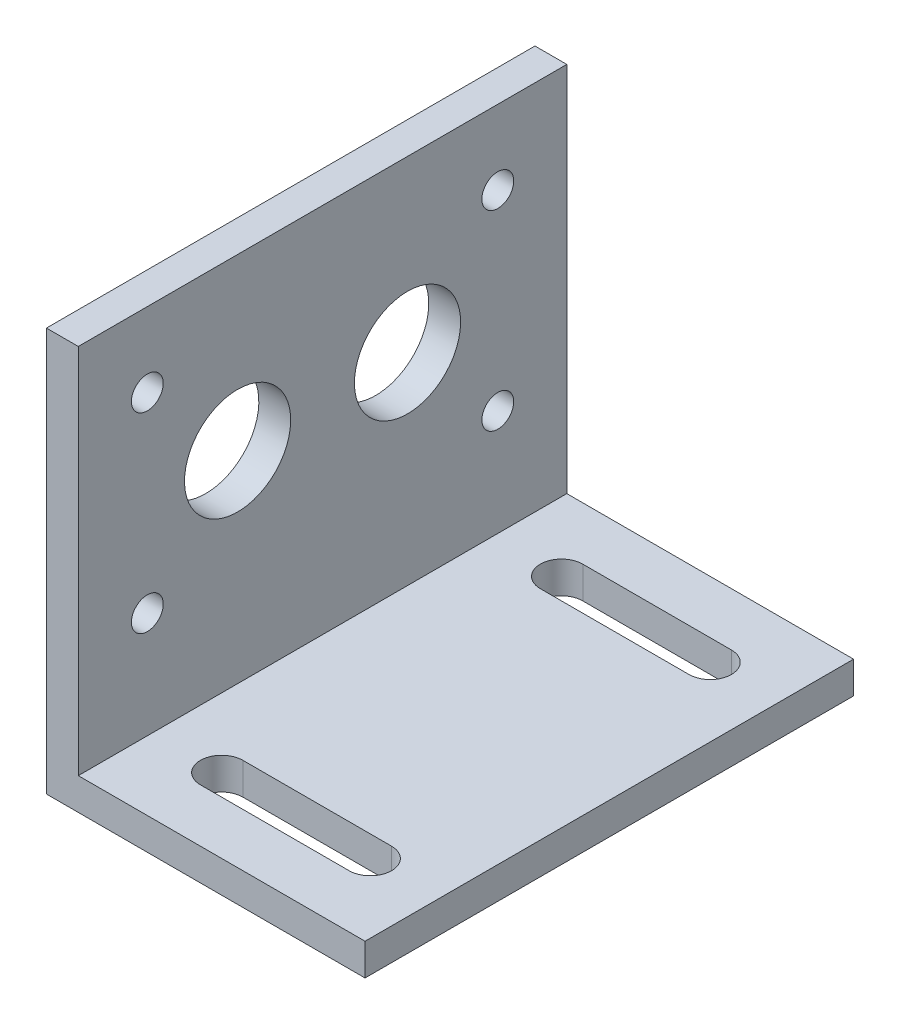
ISO-10303-21;
HEADER;
FILE_DESCRIPTION(('STEP AP214'),'2;1');
FILE_NAME('part.step','',(''),(''),'','','');
FILE_SCHEMA(('AUTOMOTIVE_DESIGN { 1 0 10303 214 1 1 1 1 }'));
ENDSEC;
DATA;
#1=APPLICATION_CONTEXT('core data for automotive mechanical design processes');
#2=APPLICATION_PROTOCOL_DEFINITION('international standard','automotive_design',2000,#1);
#3=PRODUCT_CONTEXT('',#1,'mechanical');
#4=PRODUCT('Part','Part','',(#3));
#5=PRODUCT_RELATED_PRODUCT_CATEGORY('part','',(#4));
#6=PRODUCT_DEFINITION_FORMATION('','',#4);
#7=PRODUCT_DEFINITION_CONTEXT('part definition',#1,'design');
#8=PRODUCT_DEFINITION('design','',#6,#7);
#9=PRODUCT_DEFINITION_SHAPE('','',#8);
#10=(LENGTH_UNIT() NAMED_UNIT(*) SI_UNIT(.MILLI.,.METRE.));
#11=(NAMED_UNIT(*) PLANE_ANGLE_UNIT() SI_UNIT($,.RADIAN.));
#12=(NAMED_UNIT(*) SI_UNIT($,.STERADIAN.) SOLID_ANGLE_UNIT());
#13=UNCERTAINTY_MEASURE_WITH_UNIT(LENGTH_MEASURE(1.E-05),#10,'distance_accuracy_value','');
#14=(GEOMETRIC_REPRESENTATION_CONTEXT(3) GLOBAL_UNCERTAINTY_ASSIGNED_CONTEXT((#13)) GLOBAL_UNIT_ASSIGNED_CONTEXT((#10,
#11,#12)) REPRESENTATION_CONTEXT('',''));
#15=CARTESIAN_POINT('',(0.,0.,0.));
#16=DIRECTION('',(0.,0.,1.));
#17=DIRECTION('',(1.,0.,0.));
#18=AXIS2_PLACEMENT_3D('',#15,#16,#17);
#19=CARTESIAN_POINT('',(0.,38.,46.));
#20=DIRECTION('',(1.,0.,0.));
#21=DIRECTION('',(0.,1.,0.));
#22=AXIS2_PLACEMENT_3D('',#19,#20,#21);
#23=PLANE('',#22);
#24=CARTESIAN_POINT('',(0.,22.,31.));
#25=DIRECTION('',(1.,0.,0.));
#26=DIRECTION('',(0.,1.,0.));
#27=AXIS2_PLACEMENT_3D('',#24,#25,#26);
#28=CIRCLE('',#27,5.);
#29=CARTESIAN_POINT('',(0.,27.,31.));
#30=VERTEX_POINT('',#29);
#31=EDGE_CURVE('E238',#30,#30,#28,.T.);
#32=ORIENTED_EDGE('',*,*,#31,.T.);
#33=EDGE_LOOP('',(#32));
#34=FACE_BOUND('',#33,.T.);
#35=CARTESIAN_POINT('',(0.,13.,6.5));
#36=DIRECTION('',(1.,0.,0.));
#37=DIRECTION('',(0.,1.,0.));
#38=AXIS2_PLACEMENT_3D('',#35,#36,#37);
#39=CIRCLE('',#38,1.5);
#40=CARTESIAN_POINT('',(0.,14.5,6.5));
#41=VERTEX_POINT('',#40);
#42=EDGE_CURVE('E235',#41,#41,#39,.T.);
#43=ORIENTED_EDGE('',*,*,#42,.T.);
#44=EDGE_LOOP('',(#43));
#45=FACE_BOUND('',#44,.T.);
#46=CARTESIAN_POINT('',(0.,31.,6.5));
#47=DIRECTION('',(1.,0.,0.));
#48=DIRECTION('',(0.,1.,0.));
#49=AXIS2_PLACEMENT_3D('',#46,#47,#48);
#50=CIRCLE('',#49,1.5);
#51=CARTESIAN_POINT('',(0.,32.5,6.5));
#52=VERTEX_POINT('',#51);
#53=EDGE_CURVE('E232',#52,#52,#50,.T.);
#54=ORIENTED_EDGE('',*,*,#53,.T.);
#55=EDGE_LOOP('',(#54));
#56=FACE_BOUND('',#55,.T.);
#57=CARTESIAN_POINT('',(0.,13.,39.5));
#58=DIRECTION('',(1.,0.,0.));
#59=DIRECTION('',(0.,1.,0.));
#60=AXIS2_PLACEMENT_3D('',#57,#58,#59);
#61=CIRCLE('',#60,1.5);
#62=CARTESIAN_POINT('',(0.,14.5,39.5));
#63=VERTEX_POINT('',#62);
#64=EDGE_CURVE('E229',#63,#63,#61,.T.);
#65=ORIENTED_EDGE('',*,*,#64,.T.);
#66=EDGE_LOOP('',(#65));
#67=FACE_BOUND('',#66,.T.);
#68=CARTESIAN_POINT('',(0.,22.,15.));
#69=DIRECTION('',(1.,0.,0.));
#70=DIRECTION('',(0.,1.,0.));
#71=AXIS2_PLACEMENT_3D('',#68,#69,#70);
#72=CIRCLE('',#71,5.);
#73=CARTESIAN_POINT('',(0.,27.,15.));
#74=VERTEX_POINT('',#73);
#75=EDGE_CURVE('E226',#74,#74,#72,.T.);
#76=ORIENTED_EDGE('',*,*,#75,.T.);
#77=EDGE_LOOP('',(#76));
#78=FACE_BOUND('',#77,.T.);
#79=CARTESIAN_POINT('',(0.,31.,39.5));
#80=DIRECTION('',(1.,0.,0.));
#81=DIRECTION('',(0.,1.,0.));
#82=AXIS2_PLACEMENT_3D('',#79,#80,#81);
#83=CIRCLE('',#82,1.5);
#84=CARTESIAN_POINT('',(0.,32.5,39.5));
#85=VERTEX_POINT('',#84);
#86=EDGE_CURVE('E223',#85,#85,#83,.T.);
#87=ORIENTED_EDGE('',*,*,#86,.T.);
#88=EDGE_LOOP('',(#87));
#89=FACE_BOUND('',#88,.T.);
#90=DIRECTION('',(0.,-1.,0.));
#91=VECTOR('',#90,1.);
#92=CARTESIAN_POINT('',(0.,38.,0.));
#93=LINE('',#92,#91);
#94=CARTESIAN_POINT('',(0.,38.,0.));
#95=VERTEX_POINT('',#94);
#96=CARTESIAN_POINT('',(0.,0.,0.));
#97=VERTEX_POINT('',#96);
#98=EDGE_CURVE('E241',#95,#97,#93,.T.);
#99=ORIENTED_EDGE('',*,*,#98,.T.);
#100=DIRECTION('',(0.,0.,-1.));
#101=VECTOR('',#100,1.);
#102=CARTESIAN_POINT('',(0.,0.,46.));
#103=LINE('',#102,#101);
#104=CARTESIAN_POINT('',(0.,0.,46.));
#105=VERTEX_POINT('',#104);
#106=EDGE_CURVE('E11',#105,#97,#103,.T.);
#107=ORIENTED_EDGE('',*,*,#106,.F.);
#108=DIRECTION('',(0.,-1.,0.));
#109=VECTOR('',#108,1.);
#110=CARTESIAN_POINT('',(0.,38.,46.));
#111=LINE('',#110,#109);
#112=CARTESIAN_POINT('',(0.,38.,46.));
#113=VERTEX_POINT('',#112);
#114=EDGE_CURVE('E242',#113,#105,#111,.T.);
#115=ORIENTED_EDGE('',*,*,#114,.F.);
#116=DIRECTION('',(0.,0.,-1.));
#117=VECTOR('',#116,1.);
#118=CARTESIAN_POINT('',(0.,38.,46.));
#119=LINE('',#118,#117);
#120=EDGE_CURVE('E256',#113,#95,#119,.T.);
#121=ORIENTED_EDGE('',*,*,#120,.T.);
#122=EDGE_LOOP('',(#99,#107,#115,#121));
#123=FACE_BOUND('',#122,.T.);
#124=ADVANCED_FACE('F35',(#34,#45,#56,#67,#78,#89,#123),#23,.F.);
#125=CARTESIAN_POINT('',(0.,0.,46.));
#126=DIRECTION('',(0.,1.,0.));
#127=DIRECTION('',(0.,0.,1.));
#128=AXIS2_PLACEMENT_3D('',#125,#126,#127);
#129=PLANE('',#128);
#130=DIRECTION('',(-1.,0.,0.));
#131=VECTOR('',#130,1.);
#132=CARTESIAN_POINT('',(0.,0.,5.));
#133=LINE('',#132,#131);
#134=CARTESIAN_POINT('',(23.5,0.,5.));
#135=VERTEX_POINT('',#134);
#136=CARTESIAN_POINT('',(9.5,0.,5.));
#137=VERTEX_POINT('',#136);
#138=EDGE_CURVE('E199',#135,#137,#133,.T.);
#139=ORIENTED_EDGE('',*,*,#138,.T.);
#140=CARTESIAN_POINT('',(9.5,0.,7.));
#141=DIRECTION('',(0.,1.,0.));
#142=DIRECTION('',(0.,0.,1.));
#143=AXIS2_PLACEMENT_3D('',#140,#141,#142);
#144=CIRCLE('',#143,2.);
#145=CARTESIAN_POINT('',(9.5,0.,9.));
#146=VERTEX_POINT('',#145);
#147=EDGE_CURVE('E202',#137,#146,#144,.T.);
#148=ORIENTED_EDGE('',*,*,#147,.T.);
#149=DIRECTION('',(1.,0.,0.));
#150=VECTOR('',#149,1.);
#151=CARTESIAN_POINT('',(0.,0.,8.99999999999999));
#152=LINE('',#151,#150);
#153=CARTESIAN_POINT('',(23.5,0.,8.99999999999999));
#154=VERTEX_POINT('',#153);
#155=EDGE_CURVE('E196',#146,#154,#152,.T.);
#156=ORIENTED_EDGE('',*,*,#155,.T.);
#157=CARTESIAN_POINT('',(23.5,0.,7.));
#158=DIRECTION('',(0.,1.,0.));
#159=DIRECTION('',(0.,0.,1.));
#160=AXIS2_PLACEMENT_3D('',#157,#158,#159);
#161=CIRCLE('',#160,2.);
#162=EDGE_CURVE('E140',#154,#135,#161,.T.);
#163=ORIENTED_EDGE('',*,*,#162,.T.);
#164=EDGE_LOOP('',(#139,#148,#156,#163));
#165=FACE_BOUND('',#164,.T.);
#166=DIRECTION('',(-1.,0.,0.));
#167=VECTOR('',#166,1.);
#168=CARTESIAN_POINT('',(0.,0.,37.));
#169=LINE('',#168,#167);
#170=CARTESIAN_POINT('',(23.5,0.,37.));
#171=VERTEX_POINT('',#170);
#172=CARTESIAN_POINT('',(9.5,0.,37.));
#173=VERTEX_POINT('',#172);
#174=EDGE_CURVE('E190',#171,#173,#169,.T.);
#175=ORIENTED_EDGE('',*,*,#174,.T.);
#176=CARTESIAN_POINT('',(9.5,0.,39.));
#177=DIRECTION('',(0.,1.,0.));
#178=DIRECTION('',(0.,0.,1.));
#179=AXIS2_PLACEMENT_3D('',#176,#177,#178);
#180=CIRCLE('',#179,2.);
#181=CARTESIAN_POINT('',(9.5,0.,41.));
#182=VERTEX_POINT('',#181);
#183=EDGE_CURVE('E193',#173,#182,#180,.T.);
#184=ORIENTED_EDGE('',*,*,#183,.T.);
#185=DIRECTION('',(1.,0.,0.));
#186=VECTOR('',#185,1.);
#187=CARTESIAN_POINT('',(0.,0.,41.));
#188=LINE('',#187,#186);
#189=CARTESIAN_POINT('',(23.5,0.,41.));
#190=VERTEX_POINT('',#189);
#191=EDGE_CURVE('E164',#182,#190,#188,.T.);
#192=ORIENTED_EDGE('',*,*,#191,.T.);
#193=CARTESIAN_POINT('',(23.5,0.,39.));
#194=DIRECTION('',(0.,1.,0.));
#195=DIRECTION('',(0.,0.,1.));
#196=AXIS2_PLACEMENT_3D('',#193,#194,#195);
#197=CIRCLE('',#196,2.);
#198=EDGE_CURVE('E187',#190,#171,#197,.T.);
#199=ORIENTED_EDGE('',*,*,#198,.T.);
#200=EDGE_LOOP('',(#175,#184,#192,#199));
#201=FACE_BOUND('',#200,.T.);
#202=DIRECTION('',(1.,0.,0.));
#203=VECTOR('',#202,1.);
#204=CARTESIAN_POINT('',(0.,0.,0.));
#205=LINE('',#204,#203);
#206=CARTESIAN_POINT('',(30.,0.,0.));
#207=VERTEX_POINT('',#206);
#208=EDGE_CURVE('E259',#97,#207,#205,.T.);
#209=ORIENTED_EDGE('',*,*,#208,.T.);
#210=DIRECTION('',(0.,0.,-1.));
#211=VECTOR('',#210,1.);
#212=CARTESIAN_POINT('',(30.,0.,46.));
#213=LINE('',#212,#211);
#214=CARTESIAN_POINT('',(30.,0.,46.));
#215=VERTEX_POINT('',#214);
#216=EDGE_CURVE('E42',#215,#207,#213,.T.);
#217=ORIENTED_EDGE('',*,*,#216,.F.);
#218=DIRECTION('',(1.,0.,0.));
#219=VECTOR('',#218,1.);
#220=CARTESIAN_POINT('',(0.,0.,46.));
#221=LINE('',#220,#219);
#222=EDGE_CURVE('E245',#105,#215,#221,.T.);
#223=ORIENTED_EDGE('',*,*,#222,.F.);
#224=ORIENTED_EDGE('',*,*,#106,.T.);
#225=EDGE_LOOP('',(#209,#217,#223,#224));
#226=FACE_BOUND('',#225,.T.);
#227=ADVANCED_FACE('F305',(#165,#201,#226),#129,.F.);
#228=CARTESIAN_POINT('',(30.,0.,46.));
#229=DIRECTION('',(-1.,0.,0.));
#230=DIRECTION('',(0.,0.,1.));
#231=AXIS2_PLACEMENT_3D('',#228,#229,#230);
#232=PLANE('',#231);
#233=DIRECTION('',(0.,1.,0.));
#234=VECTOR('',#233,1.);
#235=CARTESIAN_POINT('',(30.,0.,0.));
#236=LINE('',#235,#234);
#237=CARTESIAN_POINT('',(30.,3.,0.));
#238=VERTEX_POINT('',#237);
#239=EDGE_CURVE('E261',#207,#238,#236,.T.);
#240=ORIENTED_EDGE('',*,*,#239,.T.);
#241=DIRECTION('',(0.,0.,-1.));
#242=VECTOR('',#241,1.);
#243=CARTESIAN_POINT('',(30.,3.,46.));
#244=LINE('',#243,#242);
#245=CARTESIAN_POINT('',(30.,3.,46.));
#246=VERTEX_POINT('',#245);
#247=EDGE_CURVE('E276',#246,#238,#244,.T.);
#248=ORIENTED_EDGE('',*,*,#247,.F.);
#249=DIRECTION('',(0.,1.,0.));
#250=VECTOR('',#249,1.);
#251=CARTESIAN_POINT('',(30.,0.,46.));
#252=LINE('',#251,#250);
#253=EDGE_CURVE('E248',#215,#246,#252,.T.);
#254=ORIENTED_EDGE('',*,*,#253,.F.);
#255=ORIENTED_EDGE('',*,*,#216,.T.);
#256=EDGE_LOOP('',(#240,#248,#254,#255));
#257=FACE_BOUND('',#256,.T.);
#258=ADVANCED_FACE('F283',(#257),#232,.F.);
#259=CARTESIAN_POINT('',(30.,3.,46.));
#260=DIRECTION('',(0.,-1.,0.));
#261=DIRECTION('',(1.,0.,0.));
#262=AXIS2_PLACEMENT_3D('',#259,#260,#261);
#263=PLANE('',#262);
#264=DIRECTION('',(1.,0.,0.));
#265=VECTOR('',#264,1.);
#266=CARTESIAN_POINT('',(9.5,3.,9.));
#267=LINE('',#266,#265);
#268=CARTESIAN_POINT('',(9.5,3.,8.99999999999999));
#269=VERTEX_POINT('',#268);
#270=CARTESIAN_POINT('',(23.5,3.,9.));
#271=VERTEX_POINT('',#270);
#272=EDGE_CURVE('E147',#269,#271,#267,.T.);
#273=ORIENTED_EDGE('',*,*,#272,.F.);
#274=CARTESIAN_POINT('',(9.5,3.,7.));
#275=DIRECTION('',(0.,1.,0.));
#276=DIRECTION('',(-1.,0.,0.));
#277=AXIS2_PLACEMENT_3D('',#274,#275,#276);
#278=CIRCLE('',#277,2.);
#279=CARTESIAN_POINT('',(9.5,3.,5.));
#280=VERTEX_POINT('',#279);
#281=EDGE_CURVE('E152',#280,#269,#278,.T.);
#282=ORIENTED_EDGE('',*,*,#281,.F.);
#283=DIRECTION('',(-1.,0.,0.));
#284=VECTOR('',#283,1.);
#285=CARTESIAN_POINT('',(9.5,3.,5.));
#286=LINE('',#285,#284);
#287=CARTESIAN_POINT('',(23.5,3.,5.));
#288=VERTEX_POINT('',#287);
#289=EDGE_CURVE('E157',#288,#280,#286,.T.);
#290=ORIENTED_EDGE('',*,*,#289,.F.);
#291=CARTESIAN_POINT('',(23.5,3.,7.));
#292=DIRECTION('',(0.,1.,0.));
#293=DIRECTION('',(-1.,0.,0.));
#294=AXIS2_PLACEMENT_3D('',#291,#292,#293);
#295=CIRCLE('',#294,2.);
#296=EDGE_CURVE('E137',#271,#288,#295,.T.);
#297=ORIENTED_EDGE('',*,*,#296,.F.);
#298=EDGE_LOOP('',(#273,#282,#290,#297));
#299=FACE_BOUND('',#298,.T.);
#300=DIRECTION('',(1.,0.,0.));
#301=VECTOR('',#300,1.);
#302=CARTESIAN_POINT('',(9.5,3.,41.));
#303=LINE('',#302,#301);
#304=CARTESIAN_POINT('',(9.5,3.,41.));
#305=VERTEX_POINT('',#304);
#306=CARTESIAN_POINT('',(23.5,3.,41.));
#307=VERTEX_POINT('',#306);
#308=EDGE_CURVE('E169',#305,#307,#303,.T.);
#309=ORIENTED_EDGE('',*,*,#308,.F.);
#310=CARTESIAN_POINT('',(9.5,3.,39.));
#311=DIRECTION('',(0.,1.,0.));
#312=DIRECTION('',(-1.,0.,0.));
#313=AXIS2_PLACEMENT_3D('',#310,#311,#312);
#314=CIRCLE('',#313,2.);
#315=CARTESIAN_POINT('',(9.5,3.,37.));
#316=VERTEX_POINT('',#315);
#317=EDGE_CURVE('E167',#316,#305,#314,.T.);
#318=ORIENTED_EDGE('',*,*,#317,.F.);
#319=DIRECTION('',(-1.,0.,0.));
#320=VECTOR('',#319,1.);
#321=CARTESIAN_POINT('',(9.5,3.,37.));
#322=LINE('',#321,#320);
#323=CARTESIAN_POINT('',(23.5,3.,37.));
#324=VERTEX_POINT('',#323);
#325=EDGE_CURVE('E174',#324,#316,#322,.T.);
#326=ORIENTED_EDGE('',*,*,#325,.F.);
#327=CARTESIAN_POINT('',(23.5,3.,39.));
#328=DIRECTION('',(0.,1.,0.));
#329=DIRECTION('',(-1.,0.,0.));
#330=AXIS2_PLACEMENT_3D('',#327,#328,#329);
#331=CIRCLE('',#330,2.);
#332=EDGE_CURVE('E171',#307,#324,#331,.T.);
#333=ORIENTED_EDGE('',*,*,#332,.F.);
#334=EDGE_LOOP('',(#309,#318,#326,#333));
#335=FACE_BOUND('',#334,.T.);
#336=DIRECTION('',(-1.,0.,0.));
#337=VECTOR('',#336,1.);
#338=CARTESIAN_POINT('',(30.,3.,0.));
#339=LINE('',#338,#337);
#340=CARTESIAN_POINT('',(3.,3.,0.));
#341=VERTEX_POINT('',#340);
#342=EDGE_CURVE('E263',#238,#341,#339,.T.);
#343=ORIENTED_EDGE('',*,*,#342,.T.);
#344=DIRECTION('',(0.,0.,-1.));
#345=VECTOR('',#344,1.);
#346=CARTESIAN_POINT('',(3.,3.,46.));
#347=LINE('',#346,#345);
#348=CARTESIAN_POINT('',(3.,3.,46.));
#349=VERTEX_POINT('',#348);
#350=EDGE_CURVE('E273',#349,#341,#347,.T.);
#351=ORIENTED_EDGE('',*,*,#350,.F.);
#352=DIRECTION('',(-1.,0.,0.));
#353=VECTOR('',#352,1.);
#354=CARTESIAN_POINT('',(30.,3.,46.));
#355=LINE('',#354,#353);
#356=EDGE_CURVE('E250',#246,#349,#355,.T.);
#357=ORIENTED_EDGE('',*,*,#356,.F.);
#358=ORIENTED_EDGE('',*,*,#247,.T.);
#359=EDGE_LOOP('',(#343,#351,#357,#358));
#360=FACE_BOUND('',#359,.T.);
#361=ADVANCED_FACE('F154',(#299,#335,#360),#263,.F.);
#362=CARTESIAN_POINT('',(3.,3.,46.));
#363=DIRECTION('',(-1.,0.,0.));
#364=DIRECTION('',(0.,-1.,0.));
#365=AXIS2_PLACEMENT_3D('',#362,#363,#364);
#366=PLANE('',#365);
#367=CARTESIAN_POINT('',(3.,22.,31.));
#368=DIRECTION('',(1.,0.,0.));
#369=DIRECTION('',(0.,1.,0.));
#370=AXIS2_PLACEMENT_3D('',#367,#368,#369);
#371=CIRCLE('',#370,5.);
#372=CARTESIAN_POINT('',(3.,27.,31.));
#373=VERTEX_POINT('',#372);
#374=EDGE_CURVE('E208',#373,#373,#371,.T.);
#375=ORIENTED_EDGE('',*,*,#374,.F.);
#376=EDGE_LOOP('',(#375));
#377=FACE_BOUND('',#376,.T.);
#378=CARTESIAN_POINT('',(3.,13.,6.5));
#379=DIRECTION('',(1.,0.,0.));
#380=DIRECTION('',(0.,1.,0.));
#381=AXIS2_PLACEMENT_3D('',#378,#379,#380);
#382=CIRCLE('',#381,1.5);
#383=CARTESIAN_POINT('',(3.,14.5,6.5));
#384=VERTEX_POINT('',#383);
#385=EDGE_CURVE('E209',#384,#384,#382,.T.);
#386=ORIENTED_EDGE('',*,*,#385,.F.);
#387=EDGE_LOOP('',(#386));
#388=FACE_BOUND('',#387,.T.);
#389=CARTESIAN_POINT('',(3.,31.,6.5));
#390=DIRECTION('',(1.,0.,0.));
#391=DIRECTION('',(0.,1.,0.));
#392=AXIS2_PLACEMENT_3D('',#389,#390,#391);
#393=CIRCLE('',#392,1.5);
#394=CARTESIAN_POINT('',(3.,32.5,6.5));
#395=VERTEX_POINT('',#394);
#396=EDGE_CURVE('E212',#395,#395,#393,.T.);
#397=ORIENTED_EDGE('',*,*,#396,.F.);
#398=EDGE_LOOP('',(#397));
#399=FACE_BOUND('',#398,.T.);
#400=CARTESIAN_POINT('',(3.,13.,39.5));
#401=DIRECTION('',(1.,0.,0.));
#402=DIRECTION('',(0.,1.,0.));
#403=AXIS2_PLACEMENT_3D('',#400,#401,#402);
#404=CIRCLE('',#403,1.5);
#405=CARTESIAN_POINT('',(3.,14.5,39.5));
#406=VERTEX_POINT('',#405);
#407=EDGE_CURVE('E215',#406,#406,#404,.T.);
#408=ORIENTED_EDGE('',*,*,#407,.F.);
#409=EDGE_LOOP('',(#408));
#410=FACE_BOUND('',#409,.T.);
#411=CARTESIAN_POINT('',(3.,22.,15.));
#412=DIRECTION('',(1.,0.,0.));
#413=DIRECTION('',(0.,1.,0.));
#414=AXIS2_PLACEMENT_3D('',#411,#412,#413);
#415=CIRCLE('',#414,5.);
#416=CARTESIAN_POINT('',(3.,27.,15.));
#417=VERTEX_POINT('',#416);
#418=EDGE_CURVE('E205',#417,#417,#415,.T.);
#419=ORIENTED_EDGE('',*,*,#418,.F.);
#420=EDGE_LOOP('',(#419));
#421=FACE_BOUND('',#420,.T.);
#422=CARTESIAN_POINT('',(3.,31.,39.5));
#423=DIRECTION('',(1.,0.,0.));
#424=DIRECTION('',(0.,1.,0.));
#425=AXIS2_PLACEMENT_3D('',#422,#423,#424);
#426=CIRCLE('',#425,1.5);
#427=CARTESIAN_POINT('',(3.,32.5,39.5));
#428=VERTEX_POINT('',#427);
#429=EDGE_CURVE('E218',#428,#428,#426,.T.);
#430=ORIENTED_EDGE('',*,*,#429,.F.);
#431=EDGE_LOOP('',(#430));
#432=FACE_BOUND('',#431,.T.);
#433=DIRECTION('',(0.,1.,0.));
#434=VECTOR('',#433,1.);
#435=CARTESIAN_POINT('',(3.,3.,0.));
#436=LINE('',#435,#434);
#437=CARTESIAN_POINT('',(3.,38.,0.));
#438=VERTEX_POINT('',#437);
#439=EDGE_CURVE('E265',#341,#438,#436,.T.);
#440=ORIENTED_EDGE('',*,*,#439,.T.);
#441=DIRECTION('',(0.,0.,-1.));
#442=VECTOR('',#441,1.);
#443=CARTESIAN_POINT('',(3.,38.,46.));
#444=LINE('',#443,#442);
#445=CARTESIAN_POINT('',(3.,38.,46.));
#446=VERTEX_POINT('',#445);
#447=EDGE_CURVE('E270',#446,#438,#444,.T.);
#448=ORIENTED_EDGE('',*,*,#447,.F.);
#449=DIRECTION('',(0.,1.,0.));
#450=VECTOR('',#449,1.);
#451=CARTESIAN_POINT('',(3.,3.,46.));
#452=LINE('',#451,#450);
#453=EDGE_CURVE('E252',#349,#446,#452,.T.);
#454=ORIENTED_EDGE('',*,*,#453,.F.);
#455=ORIENTED_EDGE('',*,*,#350,.T.);
#456=EDGE_LOOP('',(#440,#448,#454,#455));
#457=FACE_BOUND('',#456,.T.);
#458=ADVANCED_FACE('F297',(#377,#388,#399,#410,#421,#432,#457),#366,.F.);
#459=CARTESIAN_POINT('',(3.,38.,46.));
#460=DIRECTION('',(0.,-1.,0.));
#461=DIRECTION('',(0.,0.,-1.));
#462=AXIS2_PLACEMENT_3D('',#459,#460,#461);
#463=PLANE('',#462);
#464=DIRECTION('',(-1.,0.,0.));
#465=VECTOR('',#464,1.);
#466=CARTESIAN_POINT('',(3.,38.,0.));
#467=LINE('',#466,#465);
#468=EDGE_CURVE('E246',#438,#95,#467,.T.);
#469=ORIENTED_EDGE('',*,*,#468,.T.);
#470=ORIENTED_EDGE('',*,*,#120,.F.);
#471=DIRECTION('',(-1.,0.,0.));
#472=VECTOR('',#471,1.);
#473=CARTESIAN_POINT('',(3.,38.,46.));
#474=LINE('',#473,#472);
#475=EDGE_CURVE('E254',#446,#113,#474,.T.);
#476=ORIENTED_EDGE('',*,*,#475,.F.);
#477=ORIENTED_EDGE('',*,*,#447,.T.);
#478=EDGE_LOOP('',(#469,#470,#476,#477));
#479=FACE_BOUND('',#478,.T.);
#480=ADVANCED_FACE('F308',(#479),#463,.F.);
#481=CARTESIAN_POINT('',(0.,0.,46.));
#482=DIRECTION('',(0.,0.,1.));
#483=DIRECTION('',(1.,0.,0.));
#484=AXIS2_PLACEMENT_3D('',#481,#482,#483);
#485=PLANE('',#484);
#486=ORIENTED_EDGE('',*,*,#114,.T.);
#487=ORIENTED_EDGE('',*,*,#222,.T.);
#488=ORIENTED_EDGE('',*,*,#253,.T.);
#489=ORIENTED_EDGE('',*,*,#356,.T.);
#490=ORIENTED_EDGE('',*,*,#453,.T.);
#491=ORIENTED_EDGE('',*,*,#475,.T.);
#492=EDGE_LOOP('',(#486,#487,#488,#489,#490,#491));
#493=FACE_BOUND('',#492,.T.);
#494=ADVANCED_FACE('F301',(#493),#485,.T.);
#495=CARTESIAN_POINT('',(0.,0.,0.));
#496=DIRECTION('',(0.,0.,1.));
#497=DIRECTION('',(1.,0.,0.));
#498=AXIS2_PLACEMENT_3D('',#495,#496,#497);
#499=PLANE('',#498);
#500=ORIENTED_EDGE('',*,*,#98,.F.);
#501=ORIENTED_EDGE('',*,*,#468,.F.);
#502=ORIENTED_EDGE('',*,*,#439,.F.);
#503=ORIENTED_EDGE('',*,*,#342,.F.);
#504=ORIENTED_EDGE('',*,*,#239,.F.);
#505=ORIENTED_EDGE('',*,*,#208,.F.);
#506=EDGE_LOOP('',(#500,#501,#502,#503,#504,#505));
#507=FACE_BOUND('',#506,.T.);
#508=ADVANCED_FACE('F289',(#507),#499,.F.);
#509=CARTESIAN_POINT('',(-53.,31.,39.5));
#510=DIRECTION('',(1.,0.,0.));
#511=DIRECTION('',(0.,1.,0.));
#512=AXIS2_PLACEMENT_3D('',#509,#510,#511);
#513=CYLINDRICAL_SURFACE('',#512,1.5);
#514=ORIENTED_EDGE('',*,*,#429,.T.);
#515=EDGE_LOOP('',(#514));
#516=FACE_BOUND('',#515,.T.);
#517=ORIENTED_EDGE('',*,*,#86,.F.);
#518=EDGE_LOOP('',(#517));
#519=FACE_BOUND('',#518,.T.);
#520=ADVANCED_FACE('F337',(#516,#519),#513,.F.);
#521=CARTESIAN_POINT('',(-53.,22.,15.));
#522=DIRECTION('',(1.,0.,0.));
#523=DIRECTION('',(0.,1.,0.));
#524=AXIS2_PLACEMENT_3D('',#521,#522,#523);
#525=CYLINDRICAL_SURFACE('',#524,5.);
#526=ORIENTED_EDGE('',*,*,#418,.T.);
#527=EDGE_LOOP('',(#526));
#528=FACE_BOUND('',#527,.T.);
#529=ORIENTED_EDGE('',*,*,#75,.F.);
#530=EDGE_LOOP('',(#529));
#531=FACE_BOUND('',#530,.T.);
#532=ADVANCED_FACE('F339',(#528,#531),#525,.F.);
#533=CARTESIAN_POINT('',(-53.,13.,39.5));
#534=DIRECTION('',(1.,0.,0.));
#535=DIRECTION('',(0.,1.,0.));
#536=AXIS2_PLACEMENT_3D('',#533,#534,#535);
#537=CYLINDRICAL_SURFACE('',#536,1.5);
#538=ORIENTED_EDGE('',*,*,#407,.T.);
#539=EDGE_LOOP('',(#538));
#540=FACE_BOUND('',#539,.T.);
#541=ORIENTED_EDGE('',*,*,#64,.F.);
#542=EDGE_LOOP('',(#541));
#543=FACE_BOUND('',#542,.T.);
#544=ADVANCED_FACE('F346',(#540,#543),#537,.F.);
#545=CARTESIAN_POINT('',(-53.,31.,6.5));
#546=DIRECTION('',(1.,0.,0.));
#547=DIRECTION('',(0.,1.,0.));
#548=AXIS2_PLACEMENT_3D('',#545,#546,#547);
#549=CYLINDRICAL_SURFACE('',#548,1.5);
#550=ORIENTED_EDGE('',*,*,#396,.T.);
#551=EDGE_LOOP('',(#550));
#552=FACE_BOUND('',#551,.T.);
#553=ORIENTED_EDGE('',*,*,#53,.F.);
#554=EDGE_LOOP('',(#553));
#555=FACE_BOUND('',#554,.T.);
#556=ADVANCED_FACE('F350',(#552,#555),#549,.F.);
#557=CARTESIAN_POINT('',(-53.,13.,6.5));
#558=DIRECTION('',(1.,0.,0.));
#559=DIRECTION('',(0.,1.,0.));
#560=AXIS2_PLACEMENT_3D('',#557,#558,#559);
#561=CYLINDRICAL_SURFACE('',#560,1.5);
#562=ORIENTED_EDGE('',*,*,#385,.T.);
#563=EDGE_LOOP('',(#562));
#564=FACE_BOUND('',#563,.T.);
#565=ORIENTED_EDGE('',*,*,#42,.F.);
#566=EDGE_LOOP('',(#565));
#567=FACE_BOUND('',#566,.T.);
#568=ADVANCED_FACE('F353',(#564,#567),#561,.F.);
#569=CARTESIAN_POINT('',(-53.,22.,31.));
#570=DIRECTION('',(1.,0.,0.));
#571=DIRECTION('',(0.,1.,0.));
#572=AXIS2_PLACEMENT_3D('',#569,#570,#571);
#573=CYLINDRICAL_SURFACE('',#572,5.);
#574=ORIENTED_EDGE('',*,*,#374,.T.);
#575=EDGE_LOOP('',(#574));
#576=FACE_BOUND('',#575,.T.);
#577=ORIENTED_EDGE('',*,*,#31,.F.);
#578=EDGE_LOOP('',(#577));
#579=FACE_BOUND('',#578,.T.);
#580=ADVANCED_FACE('F358',(#576,#579),#573,.F.);
#581=CARTESIAN_POINT('',(9.50000000000001,-53.,39.));
#582=DIRECTION('',(0.,1.,0.));
#583=DIRECTION('',(-1.,0.,0.));
#584=AXIS2_PLACEMENT_3D('',#581,#582,#583);
#585=CYLINDRICAL_SURFACE('',#584,2.);
#586=DIRECTION('',(0.,1.,0.));
#587=VECTOR('',#586,1.);
#588=CARTESIAN_POINT('',(9.50000000000001,-53.,37.));
#589=LINE('',#588,#587);
#590=EDGE_CURVE('E178',#173,#316,#589,.T.);
#591=ORIENTED_EDGE('',*,*,#590,.T.);
#592=ORIENTED_EDGE('',*,*,#317,.T.);
#593=DIRECTION('',(0.,1.,0.));
#594=VECTOR('',#593,1.);
#595=CARTESIAN_POINT('',(9.50000000000001,-53.,41.));
#596=LINE('',#595,#594);
#597=EDGE_CURVE('E177',#182,#305,#596,.T.);
#598=ORIENTED_EDGE('',*,*,#597,.F.);
#599=ORIENTED_EDGE('',*,*,#183,.F.);
#600=EDGE_LOOP('',(#591,#592,#598,#599));
#601=FACE_BOUND('',#600,.T.);
#602=ADVANCED_FACE('F361',(#601),#585,.F.);
#603=CARTESIAN_POINT('',(9.50000000000001,-53.,37.));
#604=DIRECTION('',(0.,0.,-1.));
#605=DIRECTION('',(-1.,0.,0.));
#606=AXIS2_PLACEMENT_3D('',#603,#604,#605);
#607=PLANE('',#606);
#608=DIRECTION('',(0.,1.,0.));
#609=VECTOR('',#608,1.);
#610=CARTESIAN_POINT('',(23.5,-53.,37.));
#611=LINE('',#610,#609);
#612=EDGE_CURVE('E180',#171,#324,#611,.T.);
#613=ORIENTED_EDGE('',*,*,#612,.T.);
#614=ORIENTED_EDGE('',*,*,#325,.T.);
#615=ORIENTED_EDGE('',*,*,#590,.F.);
#616=ORIENTED_EDGE('',*,*,#174,.F.);
#617=EDGE_LOOP('',(#613,#614,#615,#616));
#618=FACE_BOUND('',#617,.T.);
#619=ADVANCED_FACE('F368',(#618),#607,.F.);
#620=CARTESIAN_POINT('',(23.5,-53.,39.));
#621=DIRECTION('',(0.,1.,0.));
#622=DIRECTION('',(-1.,0.,0.));
#623=AXIS2_PLACEMENT_3D('',#620,#621,#622);
#624=CYLINDRICAL_SURFACE('',#623,2.);
#625=DIRECTION('',(0.,1.,0.));
#626=VECTOR('',#625,1.);
#627=CARTESIAN_POINT('',(23.5,-53.,41.));
#628=LINE('',#627,#626);
#629=EDGE_CURVE('E57',#190,#307,#628,.T.);
#630=ORIENTED_EDGE('',*,*,#629,.T.);
#631=ORIENTED_EDGE('',*,*,#332,.T.);
#632=ORIENTED_EDGE('',*,*,#612,.F.);
#633=ORIENTED_EDGE('',*,*,#198,.F.);
#634=EDGE_LOOP('',(#630,#631,#632,#633));
#635=FACE_BOUND('',#634,.T.);
#636=ADVANCED_FACE('F374',(#635),#624,.F.);
#637=CARTESIAN_POINT('',(9.50000000000001,-53.,41.));
#638=DIRECTION('',(0.,0.,1.));
#639=DIRECTION('',(1.,0.,0.));
#640=AXIS2_PLACEMENT_3D('',#637,#638,#639);
#641=PLANE('',#640);
#642=ORIENTED_EDGE('',*,*,#597,.T.);
#643=ORIENTED_EDGE('',*,*,#308,.T.);
#644=ORIENTED_EDGE('',*,*,#629,.F.);
#645=ORIENTED_EDGE('',*,*,#191,.F.);
#646=EDGE_LOOP('',(#642,#643,#644,#645));
#647=FACE_BOUND('',#646,.T.);
#648=ADVANCED_FACE('F370',(#647),#641,.F.);
#649=CARTESIAN_POINT('',(9.50000000000001,-53.,7.));
#650=DIRECTION('',(0.,1.,0.));
#651=DIRECTION('',(-1.,0.,0.));
#652=AXIS2_PLACEMENT_3D('',#649,#650,#651);
#653=CYLINDRICAL_SURFACE('',#652,2.);
#654=DIRECTION('',(0.,1.,0.));
#655=VECTOR('',#654,1.);
#656=CARTESIAN_POINT('',(9.50000000000001,-53.,5.));
#657=LINE('',#656,#655);
#658=EDGE_CURVE('E162',#137,#280,#657,.T.);
#659=ORIENTED_EDGE('',*,*,#658,.T.);
#660=ORIENTED_EDGE('',*,*,#281,.T.);
#661=DIRECTION('',(0.,1.,0.));
#662=VECTOR('',#661,1.);
#663=CARTESIAN_POINT('',(9.50000000000001,-53.,9.));
#664=LINE('',#663,#662);
#665=EDGE_CURVE('E143',#146,#269,#664,.T.);
#666=ORIENTED_EDGE('',*,*,#665,.F.);
#667=ORIENTED_EDGE('',*,*,#147,.F.);
#668=EDGE_LOOP('',(#659,#660,#666,#667));
#669=FACE_BOUND('',#668,.T.);
#670=ADVANCED_FACE('F373',(#669),#653,.F.);
#671=CARTESIAN_POINT('',(9.50000000000001,-53.,5.));
#672=DIRECTION('',(0.,0.,-1.));
#673=DIRECTION('',(-1.,0.,0.));
#674=AXIS2_PLACEMENT_3D('',#671,#672,#673);
#675=PLANE('',#674);
#676=DIRECTION('',(0.,1.,0.));
#677=VECTOR('',#676,1.);
#678=CARTESIAN_POINT('',(23.5,-53.,5.));
#679=LINE('',#678,#677);
#680=EDGE_CURVE('E142',#135,#288,#679,.T.);
#681=ORIENTED_EDGE('',*,*,#680,.T.);
#682=ORIENTED_EDGE('',*,*,#289,.T.);
#683=ORIENTED_EDGE('',*,*,#658,.F.);
#684=ORIENTED_EDGE('',*,*,#138,.F.);
#685=EDGE_LOOP('',(#681,#682,#683,#684));
#686=FACE_BOUND('',#685,.T.);
#687=ADVANCED_FACE('F383',(#686),#675,.F.);
#688=CARTESIAN_POINT('',(23.5,-53.,7.));
#689=DIRECTION('',(0.,1.,0.));
#690=DIRECTION('',(-1.,0.,0.));
#691=AXIS2_PLACEMENT_3D('',#688,#689,#690);
#692=CYLINDRICAL_SURFACE('',#691,2.);
#693=DIRECTION('',(0.,1.,0.));
#694=VECTOR('',#693,1.);
#695=CARTESIAN_POINT('',(23.5,-53.,9.));
#696=LINE('',#695,#694);
#697=EDGE_CURVE('E49',#154,#271,#696,.T.);
#698=ORIENTED_EDGE('',*,*,#697,.T.);
#699=ORIENTED_EDGE('',*,*,#296,.T.);
#700=ORIENTED_EDGE('',*,*,#680,.F.);
#701=ORIENTED_EDGE('',*,*,#162,.F.);
#702=EDGE_LOOP('',(#698,#699,#700,#701));
#703=FACE_BOUND('',#702,.T.);
#704=ADVANCED_FACE('F134',(#703),#692,.F.);
#705=CARTESIAN_POINT('',(9.50000000000001,-53.,9.));
#706=DIRECTION('',(0.,0.,1.));
#707=DIRECTION('',(1.,0.,0.));
#708=AXIS2_PLACEMENT_3D('',#705,#706,#707);
#709=PLANE('',#708);
#710=ORIENTED_EDGE('',*,*,#665,.T.);
#711=ORIENTED_EDGE('',*,*,#272,.T.);
#712=ORIENTED_EDGE('',*,*,#697,.F.);
#713=ORIENTED_EDGE('',*,*,#155,.F.);
#714=EDGE_LOOP('',(#710,#711,#712,#713));
#715=FACE_BOUND('',#714,.T.);
#716=ADVANCED_FACE('F148',(#715),#709,.F.);
#717=CLOSED_SHELL('',(#124,#227,#258,#361,#458,#480,#494,#508,#520,#532,#544,#556,#568,#580,
#602,#619,#636,#648,#670,#687,#704,#716));
#718=MANIFOLD_SOLID_BREP('B2',#717);
#719=ADVANCED_BREP_SHAPE_REPRESENTATION('',(#18,#718),#14);
#720=SHAPE_DEFINITION_REPRESENTATION(#9,#719);
ENDSEC;
END-ISO-10303-21;
